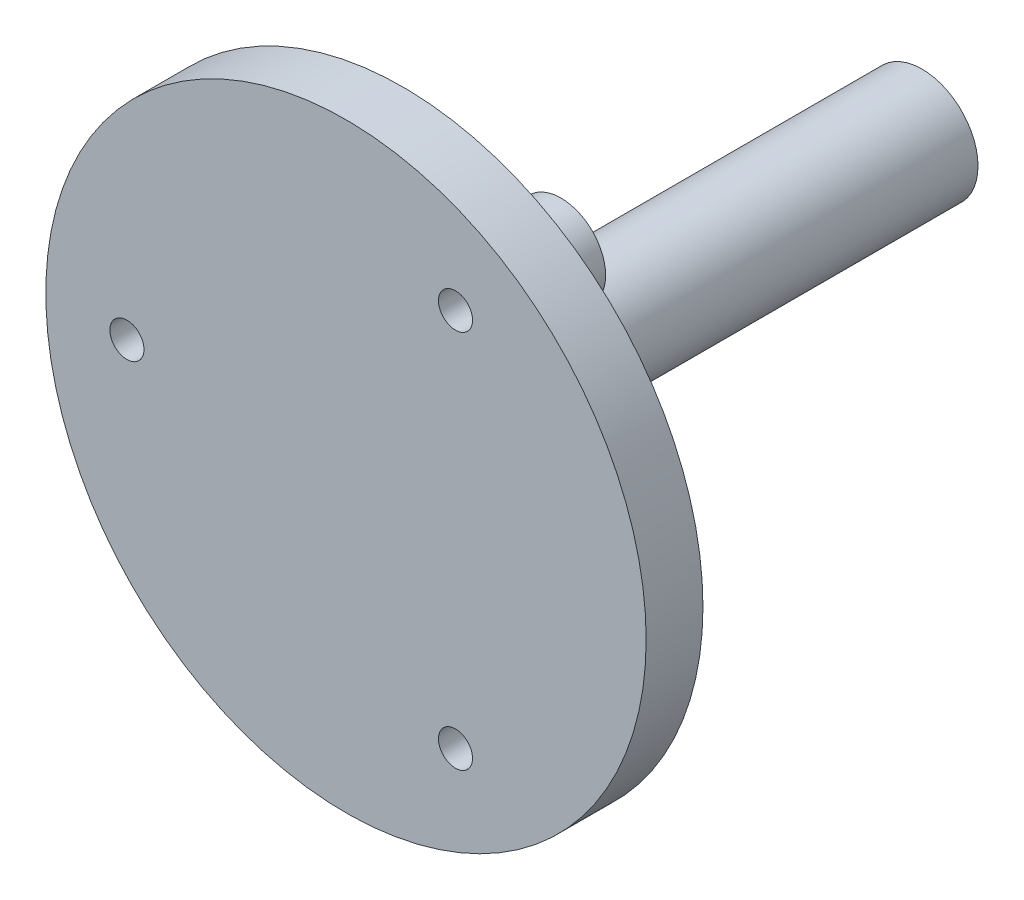
ISO-10303-21;
HEADER;
FILE_DESCRIPTION(('STEP AP214'),'2;1');
FILE_NAME('part.step','',(''),(''),'','','');
FILE_SCHEMA(('AUTOMOTIVE_DESIGN { 1 0 10303 214 1 1 1 1 }'));
ENDSEC;
DATA;
#1=APPLICATION_CONTEXT('core data for automotive mechanical design processes');
#2=APPLICATION_PROTOCOL_DEFINITION('international standard','automotive_design',2000,#1);
#3=PRODUCT_CONTEXT('',#1,'mechanical');
#4=PRODUCT('Part','Part','',(#3));
#5=PRODUCT_RELATED_PRODUCT_CATEGORY('part','',(#4));
#6=PRODUCT_DEFINITION_FORMATION('','',#4);
#7=PRODUCT_DEFINITION_CONTEXT('part definition',#1,'design');
#8=PRODUCT_DEFINITION('design','',#6,#7);
#9=PRODUCT_DEFINITION_SHAPE('','',#8);
#10=(LENGTH_UNIT() NAMED_UNIT(*) SI_UNIT(.MILLI.,.METRE.));
#11=(NAMED_UNIT(*) PLANE_ANGLE_UNIT() SI_UNIT($,.RADIAN.));
#12=(NAMED_UNIT(*) SI_UNIT($,.STERADIAN.) SOLID_ANGLE_UNIT());
#13=UNCERTAINTY_MEASURE_WITH_UNIT(LENGTH_MEASURE(1.E-05),#10,'distance_accuracy_value','');
#14=(GEOMETRIC_REPRESENTATION_CONTEXT(3) GLOBAL_UNCERTAINTY_ASSIGNED_CONTEXT((#13)) GLOBAL_UNIT_ASSIGNED_CONTEXT((#10,
#11,#12)) REPRESENTATION_CONTEXT('',''));
#15=CARTESIAN_POINT('',(0.,0.,0.));
#16=DIRECTION('',(0.,0.,1.));
#17=DIRECTION('',(1.,0.,0.));
#18=AXIS2_PLACEMENT_3D('',#15,#16,#17);
#19=CARTESIAN_POINT('',(0.,0.,10.));
#20=DIRECTION('',(0.,0.,1.));
#21=DIRECTION('',(1.,0.,0.));
#22=AXIS2_PLACEMENT_3D('',#19,#20,#21);
#23=CYLINDRICAL_SURFACE('',#22,1.4);
#24=CARTESIAN_POINT('',(0.,0.,-26.5));
#25=DIRECTION('',(0.,0.,1.));
#26=DIRECTION('',(1.,0.,0.));
#27=AXIS2_PLACEMENT_3D('',#24,#25,#26);
#28=CIRCLE('',#27,1.4);
#29=CARTESIAN_POINT('',(1.4,0.,-26.5));
#30=VERTEX_POINT('',#29);
#31=EDGE_CURVE('E88',#30,#30,#28,.T.);
#32=ORIENTED_EDGE('',*,*,#31,.T.);
#33=EDGE_LOOP('',(#32));
#34=FACE_BOUND('',#33,.T.);
#35=CARTESIAN_POINT('',(0.,0.,-35.5));
#36=DIRECTION('',(0.,0.,1.));
#37=DIRECTION('',(1.,0.,0.));
#38=AXIS2_PLACEMENT_3D('',#35,#36,#37);
#39=CIRCLE('',#38,1.4);
#40=CARTESIAN_POINT('',(1.4,0.,-35.5));
#41=VERTEX_POINT('',#40);
#42=EDGE_CURVE('E10',#41,#41,#39,.T.);
#43=ORIENTED_EDGE('',*,*,#42,.F.);
#44=EDGE_LOOP('',(#43));
#45=FACE_BOUND('',#44,.T.);
#46=ADVANCED_FACE('F37',(#34,#45),#23,.F.);
#47=CARTESIAN_POINT('',(1.4,0.,-35.5));
#48=DIRECTION('',(0.,0.,-1.));
#49=DIRECTION('',(-1.,0.,0.));
#50=AXIS2_PLACEMENT_3D('',#47,#48,#49);
#51=PLANE('',#50);
#52=ORIENTED_EDGE('',*,*,#42,.T.);
#53=EDGE_LOOP('',(#52));
#54=FACE_BOUND('',#53,.T.);
#55=CARTESIAN_POINT('',(0.,0.,-35.5));
#56=DIRECTION('',(0.,0.,1.));
#57=DIRECTION('',(1.,0.,0.));
#58=AXIS2_PLACEMENT_3D('',#55,#56,#57);
#59=CIRCLE('',#58,3.45);
#60=CARTESIAN_POINT('',(3.45,0.,-35.5));
#61=VERTEX_POINT('',#60);
#62=EDGE_CURVE('E44',#61,#61,#59,.T.);
#63=ORIENTED_EDGE('',*,*,#62,.F.);
#64=EDGE_LOOP('',(#63));
#65=FACE_BOUND('',#64,.T.);
#66=ADVANCED_FACE('F112',(#54,#65),#51,.T.);
#67=CARTESIAN_POINT('',(0.,0.,10.));
#68=DIRECTION('',(0.,0.,1.));
#69=DIRECTION('',(1.,0.,0.));
#70=AXIS2_PLACEMENT_3D('',#67,#68,#69);
#71=CYLINDRICAL_SURFACE('',#70,3.45);
#72=ORIENTED_EDGE('',*,*,#62,.T.);
#73=EDGE_LOOP('',(#72));
#74=FACE_BOUND('',#73,.T.);
#75=CARTESIAN_POINT('',(0.,0.,-3.7));
#76=DIRECTION('',(0.,0.,1.));
#77=DIRECTION('',(1.,0.,0.));
#78=AXIS2_PLACEMENT_3D('',#75,#76,#77);
#79=CIRCLE('',#78,3.45);
#80=CARTESIAN_POINT('',(3.45,0.,-3.7));
#81=VERTEX_POINT('',#80);
#82=EDGE_CURVE('E49',#81,#81,#79,.T.);
#83=ORIENTED_EDGE('',*,*,#82,.F.);
#84=EDGE_LOOP('',(#83));
#85=FACE_BOUND('',#84,.T.);
#86=ADVANCED_FACE('F110',(#74,#85),#71,.T.);
#87=CARTESIAN_POINT('',(3.45,0.,-3.7));
#88=DIRECTION('',(0.,0.,-1.));
#89=DIRECTION('',(-1.,0.,0.));
#90=AXIS2_PLACEMENT_3D('',#87,#88,#89);
#91=PLANE('',#90);
#92=ORIENTED_EDGE('',*,*,#82,.T.);
#93=EDGE_LOOP('',(#92));
#94=FACE_BOUND('',#93,.T.);
#95=CARTESIAN_POINT('',(0.,0.,-3.7));
#96=DIRECTION('',(0.,0.,1.));
#97=DIRECTION('',(1.,0.,0.));
#98=AXIS2_PLACEMENT_3D('',#95,#96,#97);
#99=CIRCLE('',#98,4.5);
#100=CARTESIAN_POINT('',(4.5,0.,-3.7));
#101=VERTEX_POINT('',#100);
#102=EDGE_CURVE('E102',#101,#101,#99,.T.);
#103=ORIENTED_EDGE('',*,*,#102,.F.);
#104=EDGE_LOOP('',(#103));
#105=FACE_BOUND('',#104,.T.);
#106=ADVANCED_FACE('F107',(#94,#105),#91,.T.);
#107=CARTESIAN_POINT('',(0.,0.,10.));
#108=DIRECTION('',(0.,0.,1.));
#109=DIRECTION('',(1.,0.,0.));
#110=AXIS2_PLACEMENT_3D('',#107,#108,#109);
#111=CYLINDRICAL_SURFACE('',#110,4.5);
#112=ORIENTED_EDGE('',*,*,#102,.T.);
#113=EDGE_LOOP('',(#112));
#114=FACE_BOUND('',#113,.T.);
#115=CARTESIAN_POINT('',(0.,0.,-3.5));
#116=DIRECTION('',(0.,0.,1.));
#117=DIRECTION('',(1.,0.,0.));
#118=AXIS2_PLACEMENT_3D('',#115,#116,#117);
#119=CIRCLE('',#118,4.5);
#120=CARTESIAN_POINT('',(4.5,0.,-3.5));
#121=VERTEX_POINT('',#120);
#122=EDGE_CURVE('E99',#121,#121,#119,.T.);
#123=ORIENTED_EDGE('',*,*,#122,.F.);
#124=EDGE_LOOP('',(#123));
#125=FACE_BOUND('',#124,.T.);
#126=ADVANCED_FACE('F119',(#114,#125),#111,.T.);
#127=CARTESIAN_POINT('',(4.5,0.,-3.5));
#128=DIRECTION('',(0.,0.,-1.));
#129=DIRECTION('',(-1.,0.,0.));
#130=AXIS2_PLACEMENT_3D('',#127,#128,#129);
#131=PLANE('',#130);
#132=CARTESIAN_POINT('',(6.74999999999985,11.69134295109,-3.5));
#133=DIRECTION('',(0.,0.,1.));
#134=DIRECTION('',(-0.499999999999992,-0.866025403784443,0.));
#135=AXIS2_PLACEMENT_3D('',#132,#133,#134);
#136=CIRCLE('',#135,2.75);
#137=CARTESIAN_POINT('',(5.37499999999987,9.30977309068279,-3.5));
#138=VERTEX_POINT('',#137);
#139=EDGE_CURVE('E73',#138,#138,#136,.T.);
#140=ORIENTED_EDGE('',*,*,#139,.T.);
#141=EDGE_LOOP('',(#140));
#142=FACE_BOUND('',#141,.T.);
#143=CARTESIAN_POINT('',(6.7500000000001,-11.6913429510899,-3.5));
#144=DIRECTION('',(0.,0.,1.));
#145=DIRECTION('',(-0.500000000000004,0.866025403784436,0.));
#146=AXIS2_PLACEMENT_3D('',#143,#144,#145);
#147=CIRCLE('',#146,2.75);
#148=CARTESIAN_POINT('',(5.37500000000009,-9.30977309068267,-3.5));
#149=VERTEX_POINT('',#148);
#150=EDGE_CURVE('E79',#149,#149,#147,.T.);
#151=ORIENTED_EDGE('',*,*,#150,.T.);
#152=EDGE_LOOP('',(#151));
#153=FACE_BOUND('',#152,.T.);
#154=CARTESIAN_POINT('',(-13.5,0.,-3.5));
#155=DIRECTION('',(0.,0.,1.));
#156=DIRECTION('',(1.,0.,0.));
#157=AXIS2_PLACEMENT_3D('',#154,#155,#156);
#158=CIRCLE('',#157,2.75);
#159=CARTESIAN_POINT('',(-10.75,0.,-3.5));
#160=VERTEX_POINT('',#159);
#161=EDGE_CURVE('E85',#160,#160,#158,.T.);
#162=ORIENTED_EDGE('',*,*,#161,.T.);
#163=EDGE_LOOP('',(#162));
#164=FACE_BOUND('',#163,.T.);
#165=ORIENTED_EDGE('',*,*,#122,.T.);
#166=EDGE_LOOP('',(#165));
#167=FACE_BOUND('',#166,.T.);
#168=CARTESIAN_POINT('',(0.,0.,-3.5));
#169=DIRECTION('',(0.,0.,1.));
#170=DIRECTION('',(1.,0.,0.));
#171=AXIS2_PLACEMENT_3D('',#168,#169,#170);
#172=CIRCLE('',#171,18.5);
#173=CARTESIAN_POINT('',(18.5,0.,-3.5));
#174=VERTEX_POINT('',#173);
#175=EDGE_CURVE('E96',#174,#174,#172,.T.);
#176=ORIENTED_EDGE('',*,*,#175,.F.);
#177=EDGE_LOOP('',(#176));
#178=FACE_BOUND('',#177,.T.);
#179=ADVANCED_FACE('F147',(#142,#153,#164,#167,#178),#131,.T.);
#180=CARTESIAN_POINT('',(0.,0.,10.));
#181=DIRECTION('',(0.,0.,1.));
#182=DIRECTION('',(1.,0.,0.));
#183=AXIS2_PLACEMENT_3D('',#180,#181,#182);
#184=CYLINDRICAL_SURFACE('',#183,18.5);
#185=ORIENTED_EDGE('',*,*,#175,.T.);
#186=EDGE_LOOP('',(#185));
#187=FACE_BOUND('',#186,.T.);
#188=CARTESIAN_POINT('',(0.,0.,0.));
#189=DIRECTION('',(0.,0.,1.));
#190=DIRECTION('',(1.,0.,0.));
#191=AXIS2_PLACEMENT_3D('',#188,#189,#190);
#192=CIRCLE('',#191,18.5);
#193=CARTESIAN_POINT('',(18.5,0.,0.));
#194=VERTEX_POINT('',#193);
#195=EDGE_CURVE('E93',#194,#194,#192,.T.);
#196=ORIENTED_EDGE('',*,*,#195,.F.);
#197=EDGE_LOOP('',(#196));
#198=FACE_BOUND('',#197,.T.);
#199=ADVANCED_FACE('F140',(#187,#198),#184,.T.);
#200=CARTESIAN_POINT('',(18.5,0.,0.));
#201=DIRECTION('',(0.,0.,1.));
#202=DIRECTION('',(1.,0.,0.));
#203=AXIS2_PLACEMENT_3D('',#200,#201,#202);
#204=PLANE('',#203);
#205=CARTESIAN_POINT('',(6.7500000000001,-11.6913429510899,0.));
#206=DIRECTION('',(0.,0.,1.));
#207=DIRECTION('',(-0.500000000000004,0.866025403784436,0.));
#208=AXIS2_PLACEMENT_3D('',#205,#206,#207);
#209=CIRCLE('',#208,1.05);
#210=CARTESIAN_POINT('',(6.22500000000009,-10.7820162771162,0.));
#211=VERTEX_POINT('',#210);
#212=EDGE_CURVE('E59',#211,#211,#209,.T.);
#213=ORIENTED_EDGE('',*,*,#212,.F.);
#214=EDGE_LOOP('',(#213));
#215=FACE_BOUND('',#214,.T.);
#216=CARTESIAN_POINT('',(6.74999999999985,11.69134295109,0.));
#217=DIRECTION('',(0.,0.,1.));
#218=DIRECTION('',(-0.499999999999992,-0.866025403784443,0.));
#219=AXIS2_PLACEMENT_3D('',#216,#217,#218);
#220=CIRCLE('',#219,1.05);
#221=CARTESIAN_POINT('',(6.22499999999986,10.7820162771163,0.));
#222=VERTEX_POINT('',#221);
#223=EDGE_CURVE('E64',#222,#222,#220,.T.);
#224=ORIENTED_EDGE('',*,*,#223,.F.);
#225=EDGE_LOOP('',(#224));
#226=FACE_BOUND('',#225,.T.);
#227=CARTESIAN_POINT('',(-13.5,0.,0.));
#228=DIRECTION('',(0.,0.,1.));
#229=DIRECTION('',(1.,0.,0.));
#230=AXIS2_PLACEMENT_3D('',#227,#228,#229);
#231=CIRCLE('',#230,1.05);
#232=CARTESIAN_POINT('',(-12.45,0.,0.));
#233=VERTEX_POINT('',#232);
#234=EDGE_CURVE('E56',#233,#233,#231,.T.);
#235=ORIENTED_EDGE('',*,*,#234,.F.);
#236=EDGE_LOOP('',(#235));
#237=FACE_BOUND('',#236,.T.);
#238=ORIENTED_EDGE('',*,*,#195,.T.);
#239=EDGE_LOOP('',(#238));
#240=FACE_BOUND('',#239,.T.);
#241=ADVANCED_FACE('F131',(#215,#226,#237,#240),#204,.T.);
#242=CARTESIAN_POINT('',(0.,0.,-26.5));
#243=DIRECTION('',(0.,0.,-1.));
#244=DIRECTION('',(-1.,0.,0.));
#245=AXIS2_PLACEMENT_3D('',#242,#243,#244);
#246=PLANE('',#245);
#247=ORIENTED_EDGE('',*,*,#31,.F.);
#248=EDGE_LOOP('',(#247));
#249=FACE_BOUND('',#248,.T.);
#250=ADVANCED_FACE('F128',(#249),#246,.T.);
#251=CARTESIAN_POINT('',(-13.5,0.,-3.5));
#252=DIRECTION('',(0.,0.,-1.));
#253=DIRECTION('',(-1.,0.,0.));
#254=AXIS2_PLACEMENT_3D('',#251,#252,#253);
#255=CYLINDRICAL_SURFACE('',#254,2.75);
#256=ORIENTED_EDGE('',*,*,#161,.F.);
#257=EDGE_LOOP('',(#256));
#258=FACE_BOUND('',#257,.T.);
#259=CARTESIAN_POINT('',(-13.5,0.,-6.5));
#260=DIRECTION('',(0.,0.,1.));
#261=DIRECTION('',(1.,0.,0.));
#262=AXIS2_PLACEMENT_3D('',#259,#260,#261);
#263=CIRCLE('',#262,2.75);
#264=CARTESIAN_POINT('',(-10.75,0.,-6.5));
#265=VERTEX_POINT('',#264);
#266=EDGE_CURVE('E82',#265,#265,#263,.T.);
#267=ORIENTED_EDGE('',*,*,#266,.T.);
#268=EDGE_LOOP('',(#267));
#269=FACE_BOUND('',#268,.T.);
#270=ADVANCED_FACE('F130',(#258,#269),#255,.T.);
#271=CARTESIAN_POINT('',(-13.5,0.,-6.5));
#272=DIRECTION('',(0.,0.,1.));
#273=DIRECTION('',(1.,0.,0.));
#274=AXIS2_PLACEMENT_3D('',#271,#272,#273);
#275=PLANE('',#274);
#276=CARTESIAN_POINT('',(-13.5,0.,-6.5));
#277=DIRECTION('',(0.,0.,1.));
#278=DIRECTION('',(1.,0.,0.));
#279=AXIS2_PLACEMENT_3D('',#276,#277,#278);
#280=CIRCLE('',#279,1.05);
#281=CARTESIAN_POINT('',(-12.45,0.,-6.5));
#282=VERTEX_POINT('',#281);
#283=EDGE_CURVE('E53',#282,#282,#280,.T.);
#284=ORIENTED_EDGE('',*,*,#283,.T.);
#285=EDGE_LOOP('',(#284));
#286=FACE_BOUND('',#285,.T.);
#287=ORIENTED_EDGE('',*,*,#266,.F.);
#288=EDGE_LOOP('',(#287));
#289=FACE_BOUND('',#288,.T.);
#290=ADVANCED_FACE('F137',(#286,#289),#275,.F.);
#291=CARTESIAN_POINT('',(6.7500000000001,-11.6913429510899,-3.5));
#292=DIRECTION('',(0.,0.,-1.));
#293=DIRECTION('',(-1.,0.,0.));
#294=AXIS2_PLACEMENT_3D('',#291,#292,#293);
#295=CYLINDRICAL_SURFACE('',#294,2.75);
#296=ORIENTED_EDGE('',*,*,#150,.F.);
#297=EDGE_LOOP('',(#296));
#298=FACE_BOUND('',#297,.T.);
#299=CARTESIAN_POINT('',(6.7500000000001,-11.6913429510899,-6.5));
#300=DIRECTION('',(0.,0.,1.));
#301=DIRECTION('',(-0.500000000000004,0.866025403784436,0.));
#302=AXIS2_PLACEMENT_3D('',#299,#300,#301);
#303=CIRCLE('',#302,2.75);
#304=CARTESIAN_POINT('',(5.37500000000009,-9.30977309068267,-6.5));
#305=VERTEX_POINT('',#304);
#306=EDGE_CURVE('E76',#305,#305,#303,.T.);
#307=ORIENTED_EDGE('',*,*,#306,.T.);
#308=EDGE_LOOP('',(#307));
#309=FACE_BOUND('',#308,.T.);
#310=ADVANCED_FACE('F200',(#298,#309),#295,.T.);
#311=CARTESIAN_POINT('',(6.7500000000001,-11.6913429510899,-6.5));
#312=DIRECTION('',(0.,0.,1.));
#313=DIRECTION('',(-0.500000000000004,0.866025403784436,0.));
#314=AXIS2_PLACEMENT_3D('',#311,#312,#313);
#315=PLANE('',#314);
#316=CARTESIAN_POINT('',(6.7500000000001,-11.6913429510899,-6.5));
#317=DIRECTION('',(0.,0.,1.));
#318=DIRECTION('',(1.,0.,0.));
#319=AXIS2_PLACEMENT_3D('',#316,#317,#318);
#320=CIRCLE('',#319,1.05);
#321=CARTESIAN_POINT('',(7.8000000000001,-11.6913429510899,-6.5));
#322=VERTEX_POINT('',#321);
#323=EDGE_CURVE('E40',#322,#322,#320,.T.);
#324=ORIENTED_EDGE('',*,*,#323,.T.);
#325=EDGE_LOOP('',(#324));
#326=FACE_BOUND('',#325,.T.);
#327=ORIENTED_EDGE('',*,*,#306,.F.);
#328=EDGE_LOOP('',(#327));
#329=FACE_BOUND('',#328,.T.);
#330=ADVANCED_FACE('F194',(#326,#329),#315,.F.);
#331=CARTESIAN_POINT('',(6.74999999999985,11.69134295109,-3.5));
#332=DIRECTION('',(0.,0.,-1.));
#333=DIRECTION('',(-1.,0.,0.));
#334=AXIS2_PLACEMENT_3D('',#331,#332,#333);
#335=CYLINDRICAL_SURFACE('',#334,2.75);
#336=ORIENTED_EDGE('',*,*,#139,.F.);
#337=EDGE_LOOP('',(#336));
#338=FACE_BOUND('',#337,.T.);
#339=CARTESIAN_POINT('',(6.74999999999985,11.69134295109,-6.5));
#340=DIRECTION('',(0.,0.,1.));
#341=DIRECTION('',(-0.499999999999992,-0.866025403784443,0.));
#342=AXIS2_PLACEMENT_3D('',#339,#340,#341);
#343=CIRCLE('',#342,2.75);
#344=CARTESIAN_POINT('',(5.37499999999987,9.30977309068279,-6.5));
#345=VERTEX_POINT('',#344);
#346=EDGE_CURVE('E55',#345,#345,#343,.T.);
#347=ORIENTED_EDGE('',*,*,#346,.T.);
#348=EDGE_LOOP('',(#347));
#349=FACE_BOUND('',#348,.T.);
#350=ADVANCED_FACE('F199',(#338,#349),#335,.T.);
#351=CARTESIAN_POINT('',(6.74999999999985,11.69134295109,-6.5));
#352=DIRECTION('',(0.,0.,1.));
#353=DIRECTION('',(-0.499999999999992,-0.866025403784443,0.));
#354=AXIS2_PLACEMENT_3D('',#351,#352,#353);
#355=PLANE('',#354);
#356=CARTESIAN_POINT('',(6.74999999999985,11.69134295109,-6.5));
#357=DIRECTION('',(0.,0.,1.));
#358=DIRECTION('',(1.,0.,0.));
#359=AXIS2_PLACEMENT_3D('',#356,#357,#358);
#360=CIRCLE('',#359,1.05);
#361=CARTESIAN_POINT('',(7.79999999999985,11.69134295109,-6.5));
#362=VERTEX_POINT('',#361);
#363=EDGE_CURVE('E57',#362,#362,#360,.T.);
#364=ORIENTED_EDGE('',*,*,#363,.T.);
#365=EDGE_LOOP('',(#364));
#366=FACE_BOUND('',#365,.T.);
#367=ORIENTED_EDGE('',*,*,#346,.F.);
#368=EDGE_LOOP('',(#367));
#369=FACE_BOUND('',#368,.T.);
#370=ADVANCED_FACE('F211',(#366,#369),#355,.F.);
#371=CARTESIAN_POINT('',(-13.5,0.,-35.5));
#372=DIRECTION('',(0.,0.,1.));
#373=DIRECTION('',(1.,0.,0.));
#374=AXIS2_PLACEMENT_3D('',#371,#372,#373);
#375=CYLINDRICAL_SURFACE('',#374,1.05);
#376=ORIENTED_EDGE('',*,*,#234,.T.);
#377=EDGE_LOOP('',(#376));
#378=FACE_BOUND('',#377,.T.);
#379=ORIENTED_EDGE('',*,*,#283,.F.);
#380=EDGE_LOOP('',(#379));
#381=FACE_BOUND('',#380,.T.);
#382=ADVANCED_FACE('F189',(#378,#381),#375,.F.);
#383=CARTESIAN_POINT('',(6.74999999999985,11.69134295109,-35.5));
#384=DIRECTION('',(0.,0.,1.));
#385=DIRECTION('',(1.,0.,0.));
#386=AXIS2_PLACEMENT_3D('',#383,#384,#385);
#387=CYLINDRICAL_SURFACE('',#386,1.05);
#388=ORIENTED_EDGE('',*,*,#223,.T.);
#389=EDGE_LOOP('',(#388));
#390=FACE_BOUND('',#389,.T.);
#391=ORIENTED_EDGE('',*,*,#363,.F.);
#392=EDGE_LOOP('',(#391));
#393=FACE_BOUND('',#392,.T.);
#394=ADVANCED_FACE('F221',(#390,#393),#387,.F.);
#395=CARTESIAN_POINT('',(6.7500000000001,-11.6913429510899,-35.5));
#396=DIRECTION('',(0.,0.,1.));
#397=DIRECTION('',(1.,0.,0.));
#398=AXIS2_PLACEMENT_3D('',#395,#396,#397);
#399=CYLINDRICAL_SURFACE('',#398,1.05);
#400=ORIENTED_EDGE('',*,*,#212,.T.);
#401=EDGE_LOOP('',(#400));
#402=FACE_BOUND('',#401,.T.);
#403=ORIENTED_EDGE('',*,*,#323,.F.);
#404=EDGE_LOOP('',(#403));
#405=FACE_BOUND('',#404,.T.);
#406=ADVANCED_FACE('F226',(#402,#405),#399,.F.);
#407=CLOSED_SHELL('',(#46,#66,#86,#106,#126,#179,#199,#241,#250,#270,#290,#310,#330,#350,#370,
#382,#394,#406));
#408=MANIFOLD_SOLID_BREP('B2',#407);
#409=ADVANCED_BREP_SHAPE_REPRESENTATION('',(#18,#408),#14);
#410=SHAPE_DEFINITION_REPRESENTATION(#9,#409);
ENDSEC;
END-ISO-10303-21;
